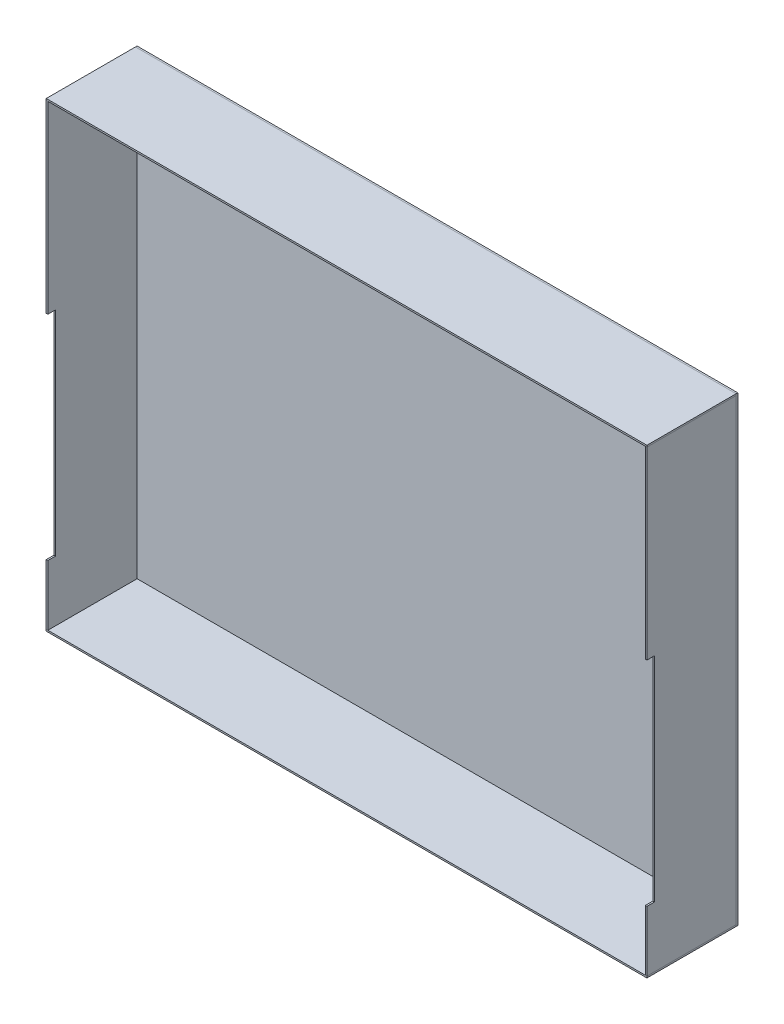
ISO-10303-21;
HEADER;
FILE_DESCRIPTION(('STEP AP214'),'2;1');
FILE_NAME('part.step','',(''),(''),'','','');
FILE_SCHEMA(('AUTOMOTIVE_DESIGN { 1 0 10303 214 1 1 1 1 }'));
ENDSEC;
DATA;
#1=APPLICATION_CONTEXT('core data for automotive mechanical design processes');
#2=APPLICATION_PROTOCOL_DEFINITION('international standard','automotive_design',2000,#1);
#3=PRODUCT_CONTEXT('',#1,'mechanical');
#4=PRODUCT('Part','Part','',(#3));
#5=PRODUCT_RELATED_PRODUCT_CATEGORY('part','',(#4));
#6=PRODUCT_DEFINITION_FORMATION('','',#4);
#7=PRODUCT_DEFINITION_CONTEXT('part definition',#1,'design');
#8=PRODUCT_DEFINITION('design','',#6,#7);
#9=PRODUCT_DEFINITION_SHAPE('','',#8);
#10=(LENGTH_UNIT() NAMED_UNIT(*) SI_UNIT(.MILLI.,.METRE.));
#11=(NAMED_UNIT(*) PLANE_ANGLE_UNIT() SI_UNIT($,.RADIAN.));
#12=(NAMED_UNIT(*) SI_UNIT($,.STERADIAN.) SOLID_ANGLE_UNIT());
#13=UNCERTAINTY_MEASURE_WITH_UNIT(LENGTH_MEASURE(1.E-05),#10,'distance_accuracy_value','');
#14=(GEOMETRIC_REPRESENTATION_CONTEXT(3) GLOBAL_UNCERTAINTY_ASSIGNED_CONTEXT((#13)) GLOBAL_UNIT_ASSIGNED_CONTEXT((#10,
#11,#12)) REPRESENTATION_CONTEXT('',''));
#15=CARTESIAN_POINT('',(0.,0.,0.));
#16=DIRECTION('',(0.,0.,1.));
#17=DIRECTION('',(1.,0.,0.));
#18=AXIS2_PLACEMENT_3D('',#15,#16,#17);
#19=CARTESIAN_POINT('',(-275.25,0.,12.));
#20=DIRECTION('',(0.,0.,1.));
#21=DIRECTION('',(1.,0.,0.));
#22=AXIS2_PLACEMENT_3D('',#19,#20,#21);
#23=PLANE('',#22);
#24=DIRECTION('',(1.,0.,0.));
#25=VECTOR('',#24,1.);
#26=CARTESIAN_POINT('',(-275.25,-155.,12.));
#27=LINE('',#26,#25);
#28=CARTESIAN_POINT('',(-276.,-155.,12.));
#29=VERTEX_POINT('',#28);
#30=CARTESIAN_POINT('',(-274.5,-155.,12.));
#31=VERTEX_POINT('',#30);
#32=EDGE_CURVE('P0_E102',#29,#31,#27,.T.);
#33=ORIENTED_EDGE('',*,*,#32,.F.);
#34=DIRECTION('',(0.,1.,0.));
#35=VECTOR('',#34,1.);
#36=CARTESIAN_POINT('',(-276.,0.,12.));
#37=LINE('',#36,#35);
#38=CARTESIAN_POINT('',(-276.,-210.5,12.));
#39=VERTEX_POINT('',#38);
#40=EDGE_CURVE('P0_E100',#39,#29,#37,.T.);
#41=ORIENTED_EDGE('',*,*,#40,.F.);
#42=DIRECTION('',(-1.,0.,0.));
#43=VECTOR('',#42,1.);
#44=CARTESIAN_POINT('',(-275.25,-210.5,12.));
#45=LINE('',#44,#43);
#46=CARTESIAN_POINT('',(-274.5,-210.5,12.));
#47=VERTEX_POINT('',#46);
#48=EDGE_CURVE('P0_E39',#47,#39,#45,.T.);
#49=ORIENTED_EDGE('',*,*,#48,.F.);
#50=DIRECTION('',(0.,-1.,0.));
#51=VECTOR('',#50,1.);
#52=CARTESIAN_POINT('',(-274.5,0.,12.));
#53=LINE('',#52,#51);
#54=EDGE_CURVE('P0_E129',#31,#47,#53,.T.);
#55=ORIENTED_EDGE('',*,*,#54,.F.);
#56=EDGE_LOOP('',(#33,#41,#49,#55));
#57=FACE_BOUND('',#56,.T.);
#58=ADVANCED_FACE('P0_F17',(#57),#23,.T.);
#59=DIRECTION('',(-1.,0.,0.));
#60=VECTOR('',#59,1.);
#61=CARTESIAN_POINT('',(-275.25,41.,12.));
#62=LINE('',#61,#60);
#63=CARTESIAN_POINT('',(-274.5,41.,12.));
#64=VERTEX_POINT('',#63);
#65=CARTESIAN_POINT('',(-276.,41.,12.));
#66=VERTEX_POINT('',#65);
#67=EDGE_CURVE('P0_E88',#64,#66,#62,.T.);
#68=ORIENTED_EDGE('',*,*,#67,.F.);
#69=CARTESIAN_POINT('',(-274.5,210.5,12.));
#70=VERTEX_POINT('',#69);
#71=EDGE_CURVE('P0_E130',#70,#64,#53,.T.);
#72=ORIENTED_EDGE('',*,*,#71,.F.);
#73=DIRECTION('',(1.,0.,0.));
#74=VECTOR('',#73,1.);
#75=CARTESIAN_POINT('',(-275.25,210.5,12.));
#76=LINE('',#75,#74);
#77=CARTESIAN_POINT('',(-276.,210.5,12.));
#78=VERTEX_POINT('',#77);
#79=EDGE_CURVE('P0_E133',#78,#70,#76,.T.);
#80=ORIENTED_EDGE('',*,*,#79,.F.);
#81=EDGE_CURVE('P0_E135',#66,#78,#37,.T.);
#82=ORIENTED_EDGE('',*,*,#81,.F.);
#83=EDGE_LOOP('',(#68,#72,#80,#82));
#84=FACE_BOUND('',#83,.T.);
#85=ADVANCED_FACE('P0_F19',(#84),#23,.T.);
#86=CARTESIAN_POINT('',(-275.25,-210.5,-70.));
#87=DIRECTION('',(0.,-1.,0.));
#88=DIRECTION('',(0.,0.,-1.));
#89=AXIS2_PLACEMENT_3D('',#86,#87,#88);
#90=PLANE('',#89);
#91=DIRECTION('',(0.,0.,1.));
#92=VECTOR('',#91,1.);
#93=CARTESIAN_POINT('',(-274.5,-210.5,-70.));
#94=LINE('',#93,#92);
#95=CARTESIAN_POINT('',(-274.5,-210.5,-70.));
#96=VERTEX_POINT('',#95);
#97=EDGE_CURVE('P0_E114',#96,#47,#94,.T.);
#98=ORIENTED_EDGE('',*,*,#97,.T.);
#99=ORIENTED_EDGE('',*,*,#48,.T.);
#100=DIRECTION('',(0.,0.,1.));
#101=VECTOR('',#100,1.);
#102=CARTESIAN_POINT('',(-276.,-210.5,-70.));
#103=LINE('',#102,#101);
#104=CARTESIAN_POINT('',(-276.,-210.5,-70.));
#105=VERTEX_POINT('',#104);
#106=EDGE_CURVE('P0_E127',#105,#39,#103,.T.);
#107=ORIENTED_EDGE('',*,*,#106,.F.);
#108=DIRECTION('',(1.,0.,0.));
#109=VECTOR('',#108,1.);
#110=CARTESIAN_POINT('',(-275.25,-210.5,-70.));
#111=LINE('',#110,#109);
#112=EDGE_CURVE('P0_E101',#105,#96,#111,.T.);
#113=ORIENTED_EDGE('',*,*,#112,.T.);
#114=EDGE_LOOP('',(#98,#99,#107,#113));
#115=FACE_BOUND('',#114,.T.);
#116=ADVANCED_FACE('P0_F159',(#115),#90,.T.);
#117=CARTESIAN_POINT('',(-276.,0.,-70.));
#118=DIRECTION('',(-1.,0.,0.));
#119=DIRECTION('',(0.,0.,1.));
#120=AXIS2_PLACEMENT_3D('',#117,#118,#119);
#121=PLANE('',#120);
#122=DIRECTION('',(0.,0.,1.));
#123=VECTOR('',#122,1.);
#124=CARTESIAN_POINT('',(-276.,-155.,-70.));
#125=LINE('',#124,#123);
#126=CARTESIAN_POINT('',(-276.,-155.,5.));
#127=VERTEX_POINT('',#126);
#128=EDGE_CURVE('P0_E92',#127,#29,#125,.T.);
#129=ORIENTED_EDGE('',*,*,#128,.F.);
#130=DIRECTION('',(0.,-1.,0.));
#131=VECTOR('',#130,1.);
#132=CARTESIAN_POINT('',(-276.,0.,5.));
#133=LINE('',#132,#131);
#134=CARTESIAN_POINT('',(-276.,41.,5.));
#135=VERTEX_POINT('',#134);
#136=EDGE_CURVE('P0_E81',#135,#127,#133,.T.);
#137=ORIENTED_EDGE('',*,*,#136,.F.);
#138=DIRECTION('',(0.,0.,-1.));
#139=VECTOR('',#138,1.);
#140=CARTESIAN_POINT('',(-276.,41.,-70.));
#141=LINE('',#140,#139);
#142=EDGE_CURVE('P0_E107',#66,#135,#141,.T.);
#143=ORIENTED_EDGE('',*,*,#142,.F.);
#144=ORIENTED_EDGE('',*,*,#81,.T.);
#145=DIRECTION('',(0.,0.,1.));
#146=VECTOR('',#145,1.);
#147=CARTESIAN_POINT('',(-276.,210.5,-70.));
#148=LINE('',#147,#146);
#149=CARTESIAN_POINT('',(-276.,210.5,-70.));
#150=VERTEX_POINT('',#149);
#151=EDGE_CURVE('P0_E124',#150,#78,#148,.T.);
#152=ORIENTED_EDGE('',*,*,#151,.F.);
#153=DIRECTION('',(0.,-1.,0.));
#154=VECTOR('',#153,1.);
#155=CARTESIAN_POINT('',(-276.,0.,-70.));
#156=LINE('',#155,#154);
#157=EDGE_CURVE('P0_E105',#150,#105,#156,.T.);
#158=ORIENTED_EDGE('',*,*,#157,.T.);
#159=ORIENTED_EDGE('',*,*,#106,.T.);
#160=ORIENTED_EDGE('',*,*,#40,.T.);
#161=EDGE_LOOP('',(#129,#137,#143,#144,#152,#158,#159,#160));
#162=FACE_BOUND('',#161,.T.);
#163=ADVANCED_FACE('P0_F98',(#162),#121,.T.);
#164=CARTESIAN_POINT('',(-275.25,210.5,-70.));
#165=DIRECTION('',(0.,1.,0.));
#166=DIRECTION('',(0.,0.,1.));
#167=AXIS2_PLACEMENT_3D('',#164,#165,#166);
#168=PLANE('',#167);
#169=ORIENTED_EDGE('',*,*,#151,.T.);
#170=ORIENTED_EDGE('',*,*,#79,.T.);
#171=DIRECTION('',(0.,0.,1.));
#172=VECTOR('',#171,1.);
#173=CARTESIAN_POINT('',(-274.5,210.5,-70.));
#174=LINE('',#173,#172);
#175=CARTESIAN_POINT('',(-274.5,210.5,-70.));
#176=VERTEX_POINT('',#175);
#177=EDGE_CURVE('P0_E121',#176,#70,#174,.T.);
#178=ORIENTED_EDGE('',*,*,#177,.F.);
#179=DIRECTION('',(-1.,0.,0.));
#180=VECTOR('',#179,1.);
#181=CARTESIAN_POINT('',(-275.25,210.5,-70.));
#182=LINE('',#181,#180);
#183=EDGE_CURVE('P0_E115',#176,#150,#182,.T.);
#184=ORIENTED_EDGE('',*,*,#183,.T.);
#185=EDGE_LOOP('',(#169,#170,#178,#184));
#186=FACE_BOUND('',#185,.T.);
#187=ADVANCED_FACE('P0_F153',(#186),#168,.T.);
#188=CARTESIAN_POINT('',(-275.25,0.,-70.));
#189=DIRECTION('',(0.,0.,-1.));
#190=DIRECTION('',(-1.,0.,0.));
#191=AXIS2_PLACEMENT_3D('',#188,#189,#190);
#192=PLANE('',#191);
#193=DIRECTION('',(0.,1.,0.));
#194=VECTOR('',#193,1.);
#195=CARTESIAN_POINT('',(-274.5,0.,-70.));
#196=LINE('',#195,#194);
#197=EDGE_CURVE('P0_E111',#96,#176,#196,.T.);
#198=ORIENTED_EDGE('',*,*,#197,.F.);
#199=ORIENTED_EDGE('',*,*,#112,.F.);
#200=ORIENTED_EDGE('',*,*,#157,.F.);
#201=ORIENTED_EDGE('',*,*,#183,.F.);
#202=EDGE_LOOP('',(#198,#199,#200,#201));
#203=FACE_BOUND('',#202,.T.);
#204=ADVANCED_FACE('P0_F156',(#203),#192,.T.);
#205=CARTESIAN_POINT('',(-274.5,0.,-70.));
#206=DIRECTION('',(1.,0.,0.));
#207=DIRECTION('',(0.,0.,-1.));
#208=AXIS2_PLACEMENT_3D('',#205,#206,#207);
#209=PLANE('',#208);
#210=DIRECTION('',(0.,0.,-1.));
#211=VECTOR('',#210,1.);
#212=CARTESIAN_POINT('',(-274.5,-155.,-70.));
#213=LINE('',#212,#211);
#214=CARTESIAN_POINT('',(-274.5,-155.,5.));
#215=VERTEX_POINT('',#214);
#216=EDGE_CURVE('P0_E11',#31,#215,#213,.T.);
#217=ORIENTED_EDGE('',*,*,#216,.F.);
#218=ORIENTED_EDGE('',*,*,#54,.T.);
#219=ORIENTED_EDGE('',*,*,#97,.F.);
#220=ORIENTED_EDGE('',*,*,#197,.T.);
#221=ORIENTED_EDGE('',*,*,#177,.T.);
#222=ORIENTED_EDGE('',*,*,#71,.T.);
#223=DIRECTION('',(0.,0.,1.));
#224=VECTOR('',#223,1.);
#225=CARTESIAN_POINT('',(-274.5,41.,-70.));
#226=LINE('',#225,#224);
#227=CARTESIAN_POINT('',(-274.5,41.,5.));
#228=VERTEX_POINT('',#227);
#229=EDGE_CURVE('P0_E25',#228,#64,#226,.T.);
#230=ORIENTED_EDGE('',*,*,#229,.F.);
#231=DIRECTION('',(0.,1.,0.));
#232=VECTOR('',#231,1.);
#233=CARTESIAN_POINT('',(-274.5,0.,5.));
#234=LINE('',#233,#232);
#235=EDGE_CURVE('P0_E138',#215,#228,#234,.T.);
#236=ORIENTED_EDGE('',*,*,#235,.F.);
#237=EDGE_LOOP('',(#217,#218,#219,#220,#221,#222,#230,#236));
#238=FACE_BOUND('',#237,.T.);
#239=ADVANCED_FACE('P0_F149',(#238),#209,.T.);
#240=CARTESIAN_POINT('',(-275.25,-155.,5.));
#241=DIRECTION('',(0.,-1.,0.));
#242=DIRECTION('',(0.,0.,-1.));
#243=AXIS2_PLACEMENT_3D('',#240,#241,#242);
#244=PLANE('',#243);
#245=ORIENTED_EDGE('',*,*,#128,.T.);
#246=ORIENTED_EDGE('',*,*,#32,.T.);
#247=ORIENTED_EDGE('',*,*,#216,.T.);
#248=DIRECTION('',(1.,0.,0.));
#249=VECTOR('',#248,1.);
#250=CARTESIAN_POINT('',(-275.25,-155.,5.));
#251=LINE('',#250,#249);
#252=EDGE_CURVE('P0_E32',#127,#215,#251,.T.);
#253=ORIENTED_EDGE('',*,*,#252,.F.);
#254=EDGE_LOOP('',(#245,#246,#247,#253));
#255=FACE_BOUND('',#254,.T.);
#256=ADVANCED_FACE('P0_F91',(#255),#244,.F.);
#257=CARTESIAN_POINT('',(-275.25,41.,5.));
#258=DIRECTION('',(0.,1.,0.));
#259=DIRECTION('',(0.,0.,1.));
#260=AXIS2_PLACEMENT_3D('',#257,#258,#259);
#261=PLANE('',#260);
#262=ORIENTED_EDGE('',*,*,#142,.T.);
#263=DIRECTION('',(-1.,0.,0.));
#264=VECTOR('',#263,1.);
#265=CARTESIAN_POINT('',(-275.25,41.,5.));
#266=LINE('',#265,#264);
#267=EDGE_CURVE('P0_E84',#228,#135,#266,.T.);
#268=ORIENTED_EDGE('',*,*,#267,.F.);
#269=ORIENTED_EDGE('',*,*,#229,.T.);
#270=ORIENTED_EDGE('',*,*,#67,.T.);
#271=EDGE_LOOP('',(#262,#268,#269,#270));
#272=FACE_BOUND('',#271,.T.);
#273=ADVANCED_FACE('P0_F142',(#272),#261,.F.);
#274=CARTESIAN_POINT('',(-275.25,-57.,5.));
#275=DIRECTION('',(0.,0.,-1.));
#276=DIRECTION('',(-1.,0.,0.));
#277=AXIS2_PLACEMENT_3D('',#274,#275,#276);
#278=PLANE('',#277);
#279=ORIENTED_EDGE('',*,*,#136,.T.);
#280=ORIENTED_EDGE('',*,*,#252,.T.);
#281=ORIENTED_EDGE('',*,*,#235,.T.);
#282=ORIENTED_EDGE('',*,*,#267,.T.);
#283=EDGE_LOOP('',(#279,#280,#281,#282));
#284=FACE_BOUND('',#283,.T.);
#285=ADVANCED_FACE('P0_F82',(#284),#278,.F.);
#286=CLOSED_SHELL('',(#58,#85,#116,#163,#187,#204,#239,#256,#273,#285));
#287=MANIFOLD_SOLID_BREP('P0_B1',#286);
#288=CARTESIAN_POINT('',(0.,-211.25,12.));
#289=DIRECTION('',(0.,0.,1.));
#290=DIRECTION('',(1.,0.,0.));
#291=AXIS2_PLACEMENT_3D('',#288,#289,#290);
#292=PLANE('',#291);
#293=DIRECTION('',(-1.,0.,0.));
#294=VECTOR('',#293,1.);
#295=CARTESIAN_POINT('',(0.,-212.,12.));
#296=LINE('',#295,#294);
#297=CARTESIAN_POINT('',(276.,-212.,12.));
#298=VERTEX_POINT('',#297);
#299=CARTESIAN_POINT('',(-276.,-212.,12.));
#300=VERTEX_POINT('',#299);
#301=EDGE_CURVE('P1_E11',#298,#300,#296,.T.);
#302=ORIENTED_EDGE('',*,*,#301,.F.);
#303=DIRECTION('',(0.,-1.,0.));
#304=VECTOR('',#303,1.);
#305=CARTESIAN_POINT('',(276.,-211.25,12.));
#306=LINE('',#305,#304);
#307=CARTESIAN_POINT('',(276.,-210.5,12.));
#308=VERTEX_POINT('',#307);
#309=EDGE_CURVE('P1_E61',#308,#298,#306,.T.);
#310=ORIENTED_EDGE('',*,*,#309,.F.);
#311=DIRECTION('',(1.,0.,0.));
#312=VECTOR('',#311,1.);
#313=CARTESIAN_POINT('',(0.,-210.5,12.));
#314=LINE('',#313,#312);
#315=CARTESIAN_POINT('',(-276.,-210.5,12.));
#316=VERTEX_POINT('',#315);
#317=EDGE_CURVE('P1_E87',#316,#308,#314,.T.);
#318=ORIENTED_EDGE('',*,*,#317,.F.);
#319=DIRECTION('',(0.,1.,0.));
#320=VECTOR('',#319,1.);
#321=CARTESIAN_POINT('',(-276.,-211.25,12.));
#322=LINE('',#321,#320);
#323=EDGE_CURVE('P1_E24',#300,#316,#322,.T.);
#324=ORIENTED_EDGE('',*,*,#323,.F.);
#325=EDGE_LOOP('',(#302,#310,#318,#324));
#326=FACE_BOUND('',#325,.T.);
#327=ADVANCED_FACE('P1_F17',(#326),#292,.T.);
#328=CARTESIAN_POINT('',(0.,-212.,-70.));
#329=DIRECTION('',(0.,-1.,0.));
#330=DIRECTION('',(0.,0.,-1.));
#331=AXIS2_PLACEMENT_3D('',#328,#329,#330);
#332=PLANE('',#331);
#333=DIRECTION('',(0.,0.,1.));
#334=VECTOR('',#333,1.);
#335=CARTESIAN_POINT('',(276.,-212.,-70.));
#336=LINE('',#335,#334);
#337=CARTESIAN_POINT('',(276.,-212.,-70.));
#338=VERTEX_POINT('',#337);
#339=EDGE_CURVE('P1_E54',#338,#298,#336,.T.);
#340=ORIENTED_EDGE('',*,*,#339,.T.);
#341=ORIENTED_EDGE('',*,*,#301,.T.);
#342=DIRECTION('',(0.,0.,1.));
#343=VECTOR('',#342,1.);
#344=CARTESIAN_POINT('',(-276.,-212.,-70.));
#345=LINE('',#344,#343);
#346=CARTESIAN_POINT('',(-276.,-212.,-70.));
#347=VERTEX_POINT('',#346);
#348=EDGE_CURVE('P1_E67',#347,#300,#345,.T.);
#349=ORIENTED_EDGE('',*,*,#348,.F.);
#350=DIRECTION('',(1.,0.,0.));
#351=VECTOR('',#350,1.);
#352=CARTESIAN_POINT('',(0.,-212.,-70.));
#353=LINE('',#352,#351);
#354=EDGE_CURVE('P1_E65',#347,#338,#353,.T.);
#355=ORIENTED_EDGE('',*,*,#354,.T.);
#356=EDGE_LOOP('',(#340,#341,#349,#355));
#357=FACE_BOUND('',#356,.T.);
#358=ADVANCED_FACE('P1_F66',(#357),#332,.T.);
#359=CARTESIAN_POINT('',(-276.,-211.25,-70.));
#360=DIRECTION('',(-1.,0.,0.));
#361=DIRECTION('',(0.,0.,1.));
#362=AXIS2_PLACEMENT_3D('',#359,#360,#361);
#363=PLANE('',#362);
#364=ORIENTED_EDGE('',*,*,#348,.T.);
#365=ORIENTED_EDGE('',*,*,#323,.T.);
#366=DIRECTION('',(0.,0.,1.));
#367=VECTOR('',#366,1.);
#368=CARTESIAN_POINT('',(-276.,-210.5,-70.));
#369=LINE('',#368,#367);
#370=CARTESIAN_POINT('',(-276.,-210.5,-70.));
#371=VERTEX_POINT('',#370);
#372=EDGE_CURVE('P1_E82',#371,#316,#369,.T.);
#373=ORIENTED_EDGE('',*,*,#372,.F.);
#374=DIRECTION('',(0.,-1.,0.));
#375=VECTOR('',#374,1.);
#376=CARTESIAN_POINT('',(-276.,-211.25,-70.));
#377=LINE('',#376,#375);
#378=EDGE_CURVE('P1_E71',#371,#347,#377,.T.);
#379=ORIENTED_EDGE('',*,*,#378,.T.);
#380=EDGE_LOOP('',(#364,#365,#373,#379));
#381=FACE_BOUND('',#380,.T.);
#382=ADVANCED_FACE('P1_F91',(#381),#363,.T.);
#383=CARTESIAN_POINT('',(0.,-210.5,-70.));
#384=DIRECTION('',(0.,1.,0.));
#385=DIRECTION('',(0.,0.,1.));
#386=AXIS2_PLACEMENT_3D('',#383,#384,#385);
#387=PLANE('',#386);
#388=ORIENTED_EDGE('',*,*,#372,.T.);
#389=ORIENTED_EDGE('',*,*,#317,.T.);
#390=DIRECTION('',(0.,0.,1.));
#391=VECTOR('',#390,1.);
#392=CARTESIAN_POINT('',(276.,-210.5,-70.));
#393=LINE('',#392,#391);
#394=CARTESIAN_POINT('',(276.,-210.5,-70.));
#395=VERTEX_POINT('',#394);
#396=EDGE_CURVE('P1_E62',#395,#308,#393,.T.);
#397=ORIENTED_EDGE('',*,*,#396,.F.);
#398=DIRECTION('',(-1.,0.,0.));
#399=VECTOR('',#398,1.);
#400=CARTESIAN_POINT('',(0.,-210.5,-70.));
#401=LINE('',#400,#399);
#402=EDGE_CURVE('P1_E76',#395,#371,#401,.T.);
#403=ORIENTED_EDGE('',*,*,#402,.T.);
#404=EDGE_LOOP('',(#388,#389,#397,#403));
#405=FACE_BOUND('',#404,.T.);
#406=ADVANCED_FACE('P1_F89',(#405),#387,.T.);
#407=CARTESIAN_POINT('',(0.,-211.25,-70.));
#408=DIRECTION('',(0.,0.,-1.));
#409=DIRECTION('',(-1.,0.,0.));
#410=AXIS2_PLACEMENT_3D('',#407,#408,#409);
#411=PLANE('',#410);
#412=DIRECTION('',(0.,1.,0.));
#413=VECTOR('',#412,1.);
#414=CARTESIAN_POINT('',(276.,-211.25,-70.));
#415=LINE('',#414,#413);
#416=EDGE_CURVE('P1_E59',#338,#395,#415,.T.);
#417=ORIENTED_EDGE('',*,*,#416,.F.);
#418=ORIENTED_EDGE('',*,*,#354,.F.);
#419=ORIENTED_EDGE('',*,*,#378,.F.);
#420=ORIENTED_EDGE('',*,*,#402,.F.);
#421=EDGE_LOOP('',(#417,#418,#419,#420));
#422=FACE_BOUND('',#421,.T.);
#423=ADVANCED_FACE('P1_F74',(#422),#411,.T.);
#424=CARTESIAN_POINT('',(276.,-211.25,-70.));
#425=DIRECTION('',(1.,0.,0.));
#426=DIRECTION('',(0.,0.,-1.));
#427=AXIS2_PLACEMENT_3D('',#424,#425,#426);
#428=PLANE('',#427);
#429=ORIENTED_EDGE('',*,*,#416,.T.);
#430=ORIENTED_EDGE('',*,*,#396,.T.);
#431=ORIENTED_EDGE('',*,*,#309,.T.);
#432=ORIENTED_EDGE('',*,*,#339,.F.);
#433=EDGE_LOOP('',(#429,#430,#431,#432));
#434=FACE_BOUND('',#433,.T.);
#435=ADVANCED_FACE('P1_F56',(#434),#428,.T.);
#436=CLOSED_SHELL('',(#327,#358,#382,#406,#423,#435));
#437=MANIFOLD_SOLID_BREP('P1_B1',#436);
#438=CARTESIAN_POINT('',(275.25,0.,12.));
#439=DIRECTION('',(0.,0.,1.));
#440=DIRECTION('',(1.,0.,0.));
#441=AXIS2_PLACEMENT_3D('',#438,#439,#440);
#442=PLANE('',#441);
#443=DIRECTION('',(1.,0.,0.));
#444=VECTOR('',#443,1.);
#445=CARTESIAN_POINT('',(275.25,-155.,12.));
#446=LINE('',#445,#444);
#447=CARTESIAN_POINT('',(274.5,-155.,12.));
#448=VERTEX_POINT('',#447);
#449=CARTESIAN_POINT('',(276.,-155.,12.));
#450=VERTEX_POINT('',#449);
#451=EDGE_CURVE('P2_E102',#448,#450,#446,.T.);
#452=ORIENTED_EDGE('',*,*,#451,.F.);
#453=DIRECTION('',(0.,1.,0.));
#454=VECTOR('',#453,1.);
#455=CARTESIAN_POINT('',(274.5,0.,12.));
#456=LINE('',#455,#454);
#457=CARTESIAN_POINT('',(274.5,-210.5,12.));
#458=VERTEX_POINT('',#457);
#459=EDGE_CURVE('P2_E100',#458,#448,#456,.T.);
#460=ORIENTED_EDGE('',*,*,#459,.F.);
#461=DIRECTION('',(-1.,0.,0.));
#462=VECTOR('',#461,1.);
#463=CARTESIAN_POINT('',(275.25,-210.5,12.));
#464=LINE('',#463,#462);
#465=CARTESIAN_POINT('',(276.,-210.5,12.));
#466=VERTEX_POINT('',#465);
#467=EDGE_CURVE('P2_E39',#466,#458,#464,.T.);
#468=ORIENTED_EDGE('',*,*,#467,.F.);
#469=DIRECTION('',(0.,-1.,0.));
#470=VECTOR('',#469,1.);
#471=CARTESIAN_POINT('',(276.,0.,12.));
#472=LINE('',#471,#470);
#473=EDGE_CURVE('P2_E129',#450,#466,#472,.T.);
#474=ORIENTED_EDGE('',*,*,#473,.F.);
#475=EDGE_LOOP('',(#452,#460,#468,#474));
#476=FACE_BOUND('',#475,.T.);
#477=ADVANCED_FACE('P2_F17',(#476),#442,.T.);
#478=DIRECTION('',(-1.,0.,0.));
#479=VECTOR('',#478,1.);
#480=CARTESIAN_POINT('',(275.25,41.,12.));
#481=LINE('',#480,#479);
#482=CARTESIAN_POINT('',(276.,41.,12.));
#483=VERTEX_POINT('',#482);
#484=CARTESIAN_POINT('',(274.5,41.,12.));
#485=VERTEX_POINT('',#484);
#486=EDGE_CURVE('P2_E88',#483,#485,#481,.T.);
#487=ORIENTED_EDGE('',*,*,#486,.F.);
#488=CARTESIAN_POINT('',(276.,210.5,12.));
#489=VERTEX_POINT('',#488);
#490=EDGE_CURVE('P2_E130',#489,#483,#472,.T.);
#491=ORIENTED_EDGE('',*,*,#490,.F.);
#492=DIRECTION('',(1.,0.,0.));
#493=VECTOR('',#492,1.);
#494=CARTESIAN_POINT('',(275.25,210.5,12.));
#495=LINE('',#494,#493);
#496=CARTESIAN_POINT('',(274.5,210.5,12.));
#497=VERTEX_POINT('',#496);
#498=EDGE_CURVE('P2_E133',#497,#489,#495,.T.);
#499=ORIENTED_EDGE('',*,*,#498,.F.);
#500=EDGE_CURVE('P2_E135',#485,#497,#456,.T.);
#501=ORIENTED_EDGE('',*,*,#500,.F.);
#502=EDGE_LOOP('',(#487,#491,#499,#501));
#503=FACE_BOUND('',#502,.T.);
#504=ADVANCED_FACE('P2_F19',(#503),#442,.T.);
#505=CARTESIAN_POINT('',(275.25,-210.5,-70.));
#506=DIRECTION('',(0.,-1.,0.));
#507=DIRECTION('',(0.,0.,-1.));
#508=AXIS2_PLACEMENT_3D('',#505,#506,#507);
#509=PLANE('',#508);
#510=DIRECTION('',(0.,0.,1.));
#511=VECTOR('',#510,1.);
#512=CARTESIAN_POINT('',(276.,-210.5,-70.));
#513=LINE('',#512,#511);
#514=CARTESIAN_POINT('',(276.,-210.5,-70.));
#515=VERTEX_POINT('',#514);
#516=EDGE_CURVE('P2_E114',#515,#466,#513,.T.);
#517=ORIENTED_EDGE('',*,*,#516,.T.);
#518=ORIENTED_EDGE('',*,*,#467,.T.);
#519=DIRECTION('',(0.,0.,1.));
#520=VECTOR('',#519,1.);
#521=CARTESIAN_POINT('',(274.5,-210.5,-70.));
#522=LINE('',#521,#520);
#523=CARTESIAN_POINT('',(274.5,-210.5,-70.));
#524=VERTEX_POINT('',#523);
#525=EDGE_CURVE('P2_E127',#524,#458,#522,.T.);
#526=ORIENTED_EDGE('',*,*,#525,.F.);
#527=DIRECTION('',(1.,0.,0.));
#528=VECTOR('',#527,1.);
#529=CARTESIAN_POINT('',(275.25,-210.5,-70.));
#530=LINE('',#529,#528);
#531=EDGE_CURVE('P2_E101',#524,#515,#530,.T.);
#532=ORIENTED_EDGE('',*,*,#531,.T.);
#533=EDGE_LOOP('',(#517,#518,#526,#532));
#534=FACE_BOUND('',#533,.T.);
#535=ADVANCED_FACE('P2_F159',(#534),#509,.T.);
#536=CARTESIAN_POINT('',(274.5,0.,-70.));
#537=DIRECTION('',(-1.,0.,0.));
#538=DIRECTION('',(0.,0.,1.));
#539=AXIS2_PLACEMENT_3D('',#536,#537,#538);
#540=PLANE('',#539);
#541=DIRECTION('',(0.,0.,1.));
#542=VECTOR('',#541,1.);
#543=CARTESIAN_POINT('',(274.5,-155.,-70.));
#544=LINE('',#543,#542);
#545=CARTESIAN_POINT('',(274.5,-155.,5.));
#546=VERTEX_POINT('',#545);
#547=EDGE_CURVE('P2_E92',#546,#448,#544,.T.);
#548=ORIENTED_EDGE('',*,*,#547,.F.);
#549=DIRECTION('',(0.,-1.,0.));
#550=VECTOR('',#549,1.);
#551=CARTESIAN_POINT('',(274.5,0.,5.));
#552=LINE('',#551,#550);
#553=CARTESIAN_POINT('',(274.5,41.,5.));
#554=VERTEX_POINT('',#553);
#555=EDGE_CURVE('P2_E81',#554,#546,#552,.T.);
#556=ORIENTED_EDGE('',*,*,#555,.F.);
#557=DIRECTION('',(0.,0.,-1.));
#558=VECTOR('',#557,1.);
#559=CARTESIAN_POINT('',(274.5,41.,-70.));
#560=LINE('',#559,#558);
#561=EDGE_CURVE('P2_E107',#485,#554,#560,.T.);
#562=ORIENTED_EDGE('',*,*,#561,.F.);
#563=ORIENTED_EDGE('',*,*,#500,.T.);
#564=DIRECTION('',(0.,0.,1.));
#565=VECTOR('',#564,1.);
#566=CARTESIAN_POINT('',(274.5,210.5,-70.));
#567=LINE('',#566,#565);
#568=CARTESIAN_POINT('',(274.5,210.5,-70.));
#569=VERTEX_POINT('',#568);
#570=EDGE_CURVE('P2_E124',#569,#497,#567,.T.);
#571=ORIENTED_EDGE('',*,*,#570,.F.);
#572=DIRECTION('',(0.,-1.,0.));
#573=VECTOR('',#572,1.);
#574=CARTESIAN_POINT('',(274.5,0.,-70.));
#575=LINE('',#574,#573);
#576=EDGE_CURVE('P2_E105',#569,#524,#575,.T.);
#577=ORIENTED_EDGE('',*,*,#576,.T.);
#578=ORIENTED_EDGE('',*,*,#525,.T.);
#579=ORIENTED_EDGE('',*,*,#459,.T.);
#580=EDGE_LOOP('',(#548,#556,#562,#563,#571,#577,#578,#579));
#581=FACE_BOUND('',#580,.T.);
#582=ADVANCED_FACE('P2_F98',(#581),#540,.T.);
#583=CARTESIAN_POINT('',(275.25,210.5,-70.));
#584=DIRECTION('',(0.,1.,0.));
#585=DIRECTION('',(0.,0.,1.));
#586=AXIS2_PLACEMENT_3D('',#583,#584,#585);
#587=PLANE('',#586);
#588=ORIENTED_EDGE('',*,*,#570,.T.);
#589=ORIENTED_EDGE('',*,*,#498,.T.);
#590=DIRECTION('',(0.,0.,1.));
#591=VECTOR('',#590,1.);
#592=CARTESIAN_POINT('',(276.,210.5,-70.));
#593=LINE('',#592,#591);
#594=CARTESIAN_POINT('',(276.,210.5,-70.));
#595=VERTEX_POINT('',#594);
#596=EDGE_CURVE('P2_E121',#595,#489,#593,.T.);
#597=ORIENTED_EDGE('',*,*,#596,.F.);
#598=DIRECTION('',(-1.,0.,0.));
#599=VECTOR('',#598,1.);
#600=CARTESIAN_POINT('',(275.25,210.5,-70.));
#601=LINE('',#600,#599);
#602=EDGE_CURVE('P2_E115',#595,#569,#601,.T.);
#603=ORIENTED_EDGE('',*,*,#602,.T.);
#604=EDGE_LOOP('',(#588,#589,#597,#603));
#605=FACE_BOUND('',#604,.T.);
#606=ADVANCED_FACE('P2_F153',(#605),#587,.T.);
#607=CARTESIAN_POINT('',(275.25,0.,-70.));
#608=DIRECTION('',(0.,0.,-1.));
#609=DIRECTION('',(-1.,0.,0.));
#610=AXIS2_PLACEMENT_3D('',#607,#608,#609);
#611=PLANE('',#610);
#612=DIRECTION('',(0.,1.,0.));
#613=VECTOR('',#612,1.);
#614=CARTESIAN_POINT('',(276.,0.,-70.));
#615=LINE('',#614,#613);
#616=EDGE_CURVE('P2_E111',#515,#595,#615,.T.);
#617=ORIENTED_EDGE('',*,*,#616,.F.);
#618=ORIENTED_EDGE('',*,*,#531,.F.);
#619=ORIENTED_EDGE('',*,*,#576,.F.);
#620=ORIENTED_EDGE('',*,*,#602,.F.);
#621=EDGE_LOOP('',(#617,#618,#619,#620));
#622=FACE_BOUND('',#621,.T.);
#623=ADVANCED_FACE('P2_F156',(#622),#611,.T.);
#624=CARTESIAN_POINT('',(276.,0.,-70.));
#625=DIRECTION('',(1.,0.,0.));
#626=DIRECTION('',(0.,0.,-1.));
#627=AXIS2_PLACEMENT_3D('',#624,#625,#626);
#628=PLANE('',#627);
#629=DIRECTION('',(0.,0.,-1.));
#630=VECTOR('',#629,1.);
#631=CARTESIAN_POINT('',(276.,-155.,-70.));
#632=LINE('',#631,#630);
#633=CARTESIAN_POINT('',(276.,-155.,5.));
#634=VERTEX_POINT('',#633);
#635=EDGE_CURVE('P2_E11',#450,#634,#632,.T.);
#636=ORIENTED_EDGE('',*,*,#635,.F.);
#637=ORIENTED_EDGE('',*,*,#473,.T.);
#638=ORIENTED_EDGE('',*,*,#516,.F.);
#639=ORIENTED_EDGE('',*,*,#616,.T.);
#640=ORIENTED_EDGE('',*,*,#596,.T.);
#641=ORIENTED_EDGE('',*,*,#490,.T.);
#642=DIRECTION('',(0.,0.,1.));
#643=VECTOR('',#642,1.);
#644=CARTESIAN_POINT('',(276.,41.,-70.));
#645=LINE('',#644,#643);
#646=CARTESIAN_POINT('',(276.,41.,5.));
#647=VERTEX_POINT('',#646);
#648=EDGE_CURVE('P2_E25',#647,#483,#645,.T.);
#649=ORIENTED_EDGE('',*,*,#648,.F.);
#650=DIRECTION('',(0.,1.,0.));
#651=VECTOR('',#650,1.);
#652=CARTESIAN_POINT('',(276.,0.,5.));
#653=LINE('',#652,#651);
#654=EDGE_CURVE('P2_E138',#634,#647,#653,.T.);
#655=ORIENTED_EDGE('',*,*,#654,.F.);
#656=EDGE_LOOP('',(#636,#637,#638,#639,#640,#641,#649,#655));
#657=FACE_BOUND('',#656,.T.);
#658=ADVANCED_FACE('P2_F149',(#657),#628,.T.);
#659=CARTESIAN_POINT('',(275.25,-155.,5.));
#660=DIRECTION('',(0.,-1.,0.));
#661=DIRECTION('',(0.,0.,-1.));
#662=AXIS2_PLACEMENT_3D('',#659,#660,#661);
#663=PLANE('',#662);
#664=ORIENTED_EDGE('',*,*,#547,.T.);
#665=ORIENTED_EDGE('',*,*,#451,.T.);
#666=ORIENTED_EDGE('',*,*,#635,.T.);
#667=DIRECTION('',(1.,0.,0.));
#668=VECTOR('',#667,1.);
#669=CARTESIAN_POINT('',(275.25,-155.,5.));
#670=LINE('',#669,#668);
#671=EDGE_CURVE('P2_E32',#546,#634,#670,.T.);
#672=ORIENTED_EDGE('',*,*,#671,.F.);
#673=EDGE_LOOP('',(#664,#665,#666,#672));
#674=FACE_BOUND('',#673,.T.);
#675=ADVANCED_FACE('P2_F91',(#674),#663,.F.);
#676=CARTESIAN_POINT('',(275.25,41.,5.));
#677=DIRECTION('',(0.,1.,0.));
#678=DIRECTION('',(0.,0.,1.));
#679=AXIS2_PLACEMENT_3D('',#676,#677,#678);
#680=PLANE('',#679);
#681=ORIENTED_EDGE('',*,*,#561,.T.);
#682=DIRECTION('',(-1.,0.,0.));
#683=VECTOR('',#682,1.);
#684=CARTESIAN_POINT('',(275.25,41.,5.));
#685=LINE('',#684,#683);
#686=EDGE_CURVE('P2_E84',#647,#554,#685,.T.);
#687=ORIENTED_EDGE('',*,*,#686,.F.);
#688=ORIENTED_EDGE('',*,*,#648,.T.);
#689=ORIENTED_EDGE('',*,*,#486,.T.);
#690=EDGE_LOOP('',(#681,#687,#688,#689));
#691=FACE_BOUND('',#690,.T.);
#692=ADVANCED_FACE('P2_F142',(#691),#680,.F.);
#693=CARTESIAN_POINT('',(275.25,-57.,5.));
#694=DIRECTION('',(0.,0.,-1.));
#695=DIRECTION('',(-1.,0.,0.));
#696=AXIS2_PLACEMENT_3D('',#693,#694,#695);
#697=PLANE('',#696);
#698=ORIENTED_EDGE('',*,*,#555,.T.);
#699=ORIENTED_EDGE('',*,*,#671,.T.);
#700=ORIENTED_EDGE('',*,*,#654,.T.);
#701=ORIENTED_EDGE('',*,*,#686,.T.);
#702=EDGE_LOOP('',(#698,#699,#700,#701));
#703=FACE_BOUND('',#702,.T.);
#704=ADVANCED_FACE('P2_F82',(#703),#697,.F.);
#705=CLOSED_SHELL('',(#477,#504,#535,#582,#606,#623,#658,#675,#692,#704));
#706=MANIFOLD_SOLID_BREP('P2_B1',#705);
#707=CARTESIAN_POINT('',(0.,211.25,12.));
#708=DIRECTION('',(0.,0.,1.));
#709=DIRECTION('',(1.,0.,0.));
#710=AXIS2_PLACEMENT_3D('',#707,#708,#709);
#711=PLANE('',#710);
#712=DIRECTION('',(-1.,0.,0.));
#713=VECTOR('',#712,1.);
#714=CARTESIAN_POINT('',(0.,210.5,12.));
#715=LINE('',#714,#713);
#716=CARTESIAN_POINT('',(276.,210.5,12.));
#717=VERTEX_POINT('',#716);
#718=CARTESIAN_POINT('',(-276.,210.5,12.));
#719=VERTEX_POINT('',#718);
#720=EDGE_CURVE('P3_E10',#717,#719,#715,.T.);
#721=ORIENTED_EDGE('',*,*,#720,.F.);
#722=DIRECTION('',(0.,-1.,0.));
#723=VECTOR('',#722,1.);
#724=CARTESIAN_POINT('',(276.,211.25,12.));
#725=LINE('',#724,#723);
#726=CARTESIAN_POINT('',(276.,212.,12.));
#727=VERTEX_POINT('',#726);
#728=EDGE_CURVE('P3_E60',#727,#717,#725,.T.);
#729=ORIENTED_EDGE('',*,*,#728,.F.);
#730=DIRECTION('',(1.,0.,0.));
#731=VECTOR('',#730,1.);
#732=CARTESIAN_POINT('',(0.,212.,12.));
#733=LINE('',#732,#731);
#734=CARTESIAN_POINT('',(-276.,212.,12.));
#735=VERTEX_POINT('',#734);
#736=EDGE_CURVE('P3_E86',#735,#727,#733,.T.);
#737=ORIENTED_EDGE('',*,*,#736,.F.);
#738=DIRECTION('',(0.,1.,0.));
#739=VECTOR('',#738,1.);
#740=CARTESIAN_POINT('',(-276.,211.25,12.));
#741=LINE('',#740,#739);
#742=EDGE_CURVE('P3_E23',#719,#735,#741,.T.);
#743=ORIENTED_EDGE('',*,*,#742,.F.);
#744=EDGE_LOOP('',(#721,#729,#737,#743));
#745=FACE_BOUND('',#744,.T.);
#746=ADVANCED_FACE('P3_F16',(#745),#711,.T.);
#747=CARTESIAN_POINT('',(0.,210.5,-70.));
#748=DIRECTION('',(0.,-1.,0.));
#749=DIRECTION('',(0.,0.,-1.));
#750=AXIS2_PLACEMENT_3D('',#747,#748,#749);
#751=PLANE('',#750);
#752=DIRECTION('',(0.,0.,1.));
#753=VECTOR('',#752,1.);
#754=CARTESIAN_POINT('',(276.,210.5,-70.));
#755=LINE('',#754,#753);
#756=CARTESIAN_POINT('',(276.,210.5,-70.));
#757=VERTEX_POINT('',#756);
#758=EDGE_CURVE('P3_E53',#757,#717,#755,.T.);
#759=ORIENTED_EDGE('',*,*,#758,.T.);
#760=ORIENTED_EDGE('',*,*,#720,.T.);
#761=DIRECTION('',(0.,0.,1.));
#762=VECTOR('',#761,1.);
#763=CARTESIAN_POINT('',(-276.,210.5,-70.));
#764=LINE('',#763,#762);
#765=CARTESIAN_POINT('',(-276.,210.5,-70.));
#766=VERTEX_POINT('',#765);
#767=EDGE_CURVE('P3_E66',#766,#719,#764,.T.);
#768=ORIENTED_EDGE('',*,*,#767,.F.);
#769=DIRECTION('',(1.,0.,0.));
#770=VECTOR('',#769,1.);
#771=CARTESIAN_POINT('',(0.,210.5,-70.));
#772=LINE('',#771,#770);
#773=EDGE_CURVE('P3_E64',#766,#757,#772,.T.);
#774=ORIENTED_EDGE('',*,*,#773,.T.);
#775=EDGE_LOOP('',(#759,#760,#768,#774));
#776=FACE_BOUND('',#775,.T.);
#777=ADVANCED_FACE('P3_F65',(#776),#751,.T.);
#778=CARTESIAN_POINT('',(-276.,211.25,-70.));
#779=DIRECTION('',(-1.,0.,0.));
#780=DIRECTION('',(0.,0.,1.));
#781=AXIS2_PLACEMENT_3D('',#778,#779,#780);
#782=PLANE('',#781);
#783=ORIENTED_EDGE('',*,*,#767,.T.);
#784=ORIENTED_EDGE('',*,*,#742,.T.);
#785=DIRECTION('',(0.,0.,1.));
#786=VECTOR('',#785,1.);
#787=CARTESIAN_POINT('',(-276.,212.,-70.));
#788=LINE('',#787,#786);
#789=CARTESIAN_POINT('',(-276.,212.,-70.));
#790=VERTEX_POINT('',#789);
#791=EDGE_CURVE('P3_E81',#790,#735,#788,.T.);
#792=ORIENTED_EDGE('',*,*,#791,.F.);
#793=DIRECTION('',(0.,-1.,0.));
#794=VECTOR('',#793,1.);
#795=CARTESIAN_POINT('',(-276.,211.25,-70.));
#796=LINE('',#795,#794);
#797=EDGE_CURVE('P3_E70',#790,#766,#796,.T.);
#798=ORIENTED_EDGE('',*,*,#797,.T.);
#799=EDGE_LOOP('',(#783,#784,#792,#798));
#800=FACE_BOUND('',#799,.T.);
#801=ADVANCED_FACE('P3_F90',(#800),#782,.T.);
#802=CARTESIAN_POINT('',(0.,212.,-70.));
#803=DIRECTION('',(0.,1.,0.));
#804=DIRECTION('',(0.,0.,1.));
#805=AXIS2_PLACEMENT_3D('',#802,#803,#804);
#806=PLANE('',#805);
#807=ORIENTED_EDGE('',*,*,#791,.T.);
#808=ORIENTED_EDGE('',*,*,#736,.T.);
#809=DIRECTION('',(0.,0.,1.));
#810=VECTOR('',#809,1.);
#811=CARTESIAN_POINT('',(276.,212.,-70.));
#812=LINE('',#811,#810);
#813=CARTESIAN_POINT('',(276.,212.,-70.));
#814=VERTEX_POINT('',#813);
#815=EDGE_CURVE('P3_E61',#814,#727,#812,.T.);
#816=ORIENTED_EDGE('',*,*,#815,.F.);
#817=DIRECTION('',(-1.,0.,0.));
#818=VECTOR('',#817,1.);
#819=CARTESIAN_POINT('',(0.,212.,-70.));
#820=LINE('',#819,#818);
#821=EDGE_CURVE('P3_E75',#814,#790,#820,.T.);
#822=ORIENTED_EDGE('',*,*,#821,.T.);
#823=EDGE_LOOP('',(#807,#808,#816,#822));
#824=FACE_BOUND('',#823,.T.);
#825=ADVANCED_FACE('P3_F88',(#824),#806,.T.);
#826=CARTESIAN_POINT('',(0.,211.25,-70.));
#827=DIRECTION('',(0.,0.,-1.));
#828=DIRECTION('',(-1.,0.,0.));
#829=AXIS2_PLACEMENT_3D('',#826,#827,#828);
#830=PLANE('',#829);
#831=DIRECTION('',(0.,1.,0.));
#832=VECTOR('',#831,1.);
#833=CARTESIAN_POINT('',(276.,211.25,-70.));
#834=LINE('',#833,#832);
#835=EDGE_CURVE('P3_E58',#757,#814,#834,.T.);
#836=ORIENTED_EDGE('',*,*,#835,.F.);
#837=ORIENTED_EDGE('',*,*,#773,.F.);
#838=ORIENTED_EDGE('',*,*,#797,.F.);
#839=ORIENTED_EDGE('',*,*,#821,.F.);
#840=EDGE_LOOP('',(#836,#837,#838,#839));
#841=FACE_BOUND('',#840,.T.);
#842=ADVANCED_FACE('P3_F73',(#841),#830,.T.);
#843=CARTESIAN_POINT('',(276.,211.25,-70.));
#844=DIRECTION('',(1.,0.,0.));
#845=DIRECTION('',(0.,0.,-1.));
#846=AXIS2_PLACEMENT_3D('',#843,#844,#845);
#847=PLANE('',#846);
#848=ORIENTED_EDGE('',*,*,#835,.T.);
#849=ORIENTED_EDGE('',*,*,#815,.T.);
#850=ORIENTED_EDGE('',*,*,#728,.T.);
#851=ORIENTED_EDGE('',*,*,#758,.F.);
#852=EDGE_LOOP('',(#848,#849,#850,#851));
#853=FACE_BOUND('',#852,.T.);
#854=ADVANCED_FACE('P3_F55',(#853),#847,.T.);
#855=CLOSED_SHELL('',(#746,#777,#801,#825,#842,#854));
#856=MANIFOLD_SOLID_BREP('P3_B1',#855);
#857=CARTESIAN_POINT('',(0.,0.,-70.));
#858=DIRECTION('',(0.,0.,1.));
#859=DIRECTION('',(1.,0.,0.));
#860=AXIS2_PLACEMENT_3D('',#857,#858,#859);
#861=PLANE('',#860);
#862=DIRECTION('',(-1.,0.,0.));
#863=VECTOR('',#862,1.);
#864=CARTESIAN_POINT('',(0.,-212.,-70.));
#865=LINE('',#864,#863);
#866=CARTESIAN_POINT('',(276.,-212.,-70.));
#867=VERTEX_POINT('',#866);
#868=CARTESIAN_POINT('',(-276.,-212.,-70.));
#869=VERTEX_POINT('',#868);
#870=EDGE_CURVE('P4_E11',#867,#869,#865,.T.);
#871=ORIENTED_EDGE('',*,*,#870,.F.);
#872=DIRECTION('',(0.,-1.,0.));
#873=VECTOR('',#872,1.);
#874=CARTESIAN_POINT('',(276.,0.,-70.));
#875=LINE('',#874,#873);
#876=CARTESIAN_POINT('',(276.,212.,-70.));
#877=VERTEX_POINT('',#876);
#878=EDGE_CURVE('P4_E61',#877,#867,#875,.T.);
#879=ORIENTED_EDGE('',*,*,#878,.F.);
#880=DIRECTION('',(1.,0.,0.));
#881=VECTOR('',#880,1.);
#882=CARTESIAN_POINT('',(0.,212.,-70.));
#883=LINE('',#882,#881);
#884=CARTESIAN_POINT('',(-276.,212.,-70.));
#885=VERTEX_POINT('',#884);
#886=EDGE_CURVE('P4_E87',#885,#877,#883,.T.);
#887=ORIENTED_EDGE('',*,*,#886,.F.);
#888=DIRECTION('',(0.,1.,0.));
#889=VECTOR('',#888,1.);
#890=CARTESIAN_POINT('',(-276.,0.,-70.));
#891=LINE('',#890,#889);
#892=EDGE_CURVE('P4_E24',#869,#885,#891,.T.);
#893=ORIENTED_EDGE('',*,*,#892,.F.);
#894=EDGE_LOOP('',(#871,#879,#887,#893));
#895=FACE_BOUND('',#894,.T.);
#896=ADVANCED_FACE('P4_F17',(#895),#861,.T.);
#897=CARTESIAN_POINT('',(0.,-212.,-71.5));
#898=DIRECTION('',(0.,-1.,0.));
#899=DIRECTION('',(0.,0.,-1.));
#900=AXIS2_PLACEMENT_3D('',#897,#898,#899);
#901=PLANE('',#900);
#902=DIRECTION('',(0.,0.,1.));
#903=VECTOR('',#902,1.);
#904=CARTESIAN_POINT('',(276.,-212.,-71.5));
#905=LINE('',#904,#903);
#906=CARTESIAN_POINT('',(276.,-212.,-71.5));
#907=VERTEX_POINT('',#906);
#908=EDGE_CURVE('P4_E54',#907,#867,#905,.T.);
#909=ORIENTED_EDGE('',*,*,#908,.T.);
#910=ORIENTED_EDGE('',*,*,#870,.T.);
#911=DIRECTION('',(0.,0.,1.));
#912=VECTOR('',#911,1.);
#913=CARTESIAN_POINT('',(-276.,-212.,-71.5));
#914=LINE('',#913,#912);
#915=CARTESIAN_POINT('',(-276.,-212.,-71.5));
#916=VERTEX_POINT('',#915);
#917=EDGE_CURVE('P4_E67',#916,#869,#914,.T.);
#918=ORIENTED_EDGE('',*,*,#917,.F.);
#919=DIRECTION('',(1.,0.,0.));
#920=VECTOR('',#919,1.);
#921=CARTESIAN_POINT('',(0.,-212.,-71.5));
#922=LINE('',#921,#920);
#923=EDGE_CURVE('P4_E65',#916,#907,#922,.T.);
#924=ORIENTED_EDGE('',*,*,#923,.T.);
#925=EDGE_LOOP('',(#909,#910,#918,#924));
#926=FACE_BOUND('',#925,.T.);
#927=ADVANCED_FACE('P4_F66',(#926),#901,.T.);
#928=CARTESIAN_POINT('',(-276.,0.,-71.5));
#929=DIRECTION('',(-1.,0.,0.));
#930=DIRECTION('',(0.,0.,1.));
#931=AXIS2_PLACEMENT_3D('',#928,#929,#930);
#932=PLANE('',#931);
#933=ORIENTED_EDGE('',*,*,#917,.T.);
#934=ORIENTED_EDGE('',*,*,#892,.T.);
#935=DIRECTION('',(0.,0.,1.));
#936=VECTOR('',#935,1.);
#937=CARTESIAN_POINT('',(-276.,212.,-71.5));
#938=LINE('',#937,#936);
#939=CARTESIAN_POINT('',(-276.,212.,-71.5));
#940=VERTEX_POINT('',#939);
#941=EDGE_CURVE('P4_E82',#940,#885,#938,.T.);
#942=ORIENTED_EDGE('',*,*,#941,.F.);
#943=DIRECTION('',(0.,-1.,0.));
#944=VECTOR('',#943,1.);
#945=CARTESIAN_POINT('',(-276.,0.,-71.5));
#946=LINE('',#945,#944);
#947=EDGE_CURVE('P4_E71',#940,#916,#946,.T.);
#948=ORIENTED_EDGE('',*,*,#947,.T.);
#949=EDGE_LOOP('',(#933,#934,#942,#948));
#950=FACE_BOUND('',#949,.T.);
#951=ADVANCED_FACE('P4_F91',(#950),#932,.T.);
#952=CARTESIAN_POINT('',(0.,212.,-71.5));
#953=DIRECTION('',(0.,1.,0.));
#954=DIRECTION('',(0.,0.,1.));
#955=AXIS2_PLACEMENT_3D('',#952,#953,#954);
#956=PLANE('',#955);
#957=ORIENTED_EDGE('',*,*,#941,.T.);
#958=ORIENTED_EDGE('',*,*,#886,.T.);
#959=DIRECTION('',(0.,0.,1.));
#960=VECTOR('',#959,1.);
#961=CARTESIAN_POINT('',(276.,212.,-71.5));
#962=LINE('',#961,#960);
#963=CARTESIAN_POINT('',(276.,212.,-71.5));
#964=VERTEX_POINT('',#963);
#965=EDGE_CURVE('P4_E62',#964,#877,#962,.T.);
#966=ORIENTED_EDGE('',*,*,#965,.F.);
#967=DIRECTION('',(-1.,0.,0.));
#968=VECTOR('',#967,1.);
#969=CARTESIAN_POINT('',(0.,212.,-71.5));
#970=LINE('',#969,#968);
#971=EDGE_CURVE('P4_E76',#964,#940,#970,.T.);
#972=ORIENTED_EDGE('',*,*,#971,.T.);
#973=EDGE_LOOP('',(#957,#958,#966,#972));
#974=FACE_BOUND('',#973,.T.);
#975=ADVANCED_FACE('P4_F89',(#974),#956,.T.);
#976=CARTESIAN_POINT('',(0.,0.,-71.5));
#977=DIRECTION('',(0.,0.,-1.));
#978=DIRECTION('',(-1.,0.,0.));
#979=AXIS2_PLACEMENT_3D('',#976,#977,#978);
#980=PLANE('',#979);
#981=DIRECTION('',(0.,1.,0.));
#982=VECTOR('',#981,1.);
#983=CARTESIAN_POINT('',(276.,0.,-71.5));
#984=LINE('',#983,#982);
#985=EDGE_CURVE('P4_E59',#907,#964,#984,.T.);
#986=ORIENTED_EDGE('',*,*,#985,.F.);
#987=ORIENTED_EDGE('',*,*,#923,.F.);
#988=ORIENTED_EDGE('',*,*,#947,.F.);
#989=ORIENTED_EDGE('',*,*,#971,.F.);
#990=EDGE_LOOP('',(#986,#987,#988,#989));
#991=FACE_BOUND('',#990,.T.);
#992=ADVANCED_FACE('P4_F74',(#991),#980,.T.);
#993=CARTESIAN_POINT('',(276.,0.,-71.5));
#994=DIRECTION('',(1.,0.,0.));
#995=DIRECTION('',(0.,0.,-1.));
#996=AXIS2_PLACEMENT_3D('',#993,#994,#995);
#997=PLANE('',#996);
#998=ORIENTED_EDGE('',*,*,#985,.T.);
#999=ORIENTED_EDGE('',*,*,#965,.T.);
#1000=ORIENTED_EDGE('',*,*,#878,.T.);
#1001=ORIENTED_EDGE('',*,*,#908,.F.);
#1002=EDGE_LOOP('',(#998,#999,#1000,#1001));
#1003=FACE_BOUND('',#1002,.T.);
#1004=ADVANCED_FACE('P4_F56',(#1003),#997,.T.);
#1005=CLOSED_SHELL('',(#896,#927,#951,#975,#992,#1004));
#1006=MANIFOLD_SOLID_BREP('P4_B1',#1005);
#1007=ADVANCED_BREP_SHAPE_REPRESENTATION('',(#18,#287,#437,#706,#856,#1006),#14);
#1008=SHAPE_DEFINITION_REPRESENTATION(#9,#1007);
ENDSEC;
END-ISO-10303-21;
